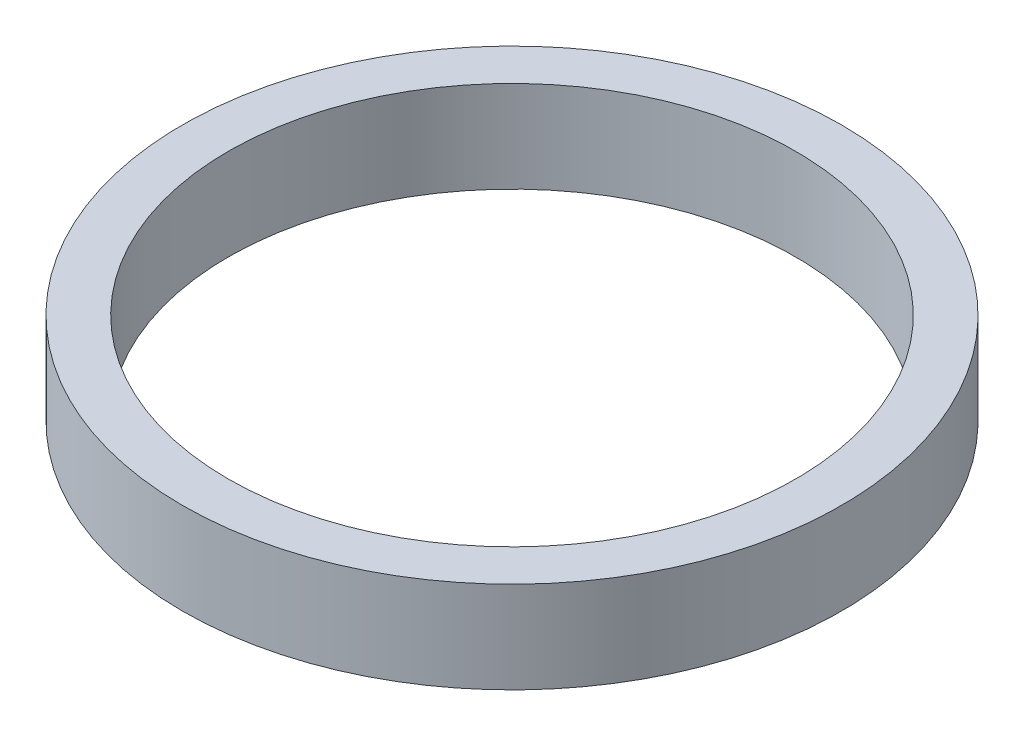
ISO-10303-21;
HEADER;
FILE_DESCRIPTION(('STEP AP214'),'2;1');
FILE_NAME('part.step','',(''),(''),'','','');
FILE_SCHEMA(('AUTOMOTIVE_DESIGN { 1 0 10303 214 1 1 1 1 }'));
ENDSEC;
DATA;
#1=APPLICATION_CONTEXT('core data for automotive mechanical design processes');
#2=APPLICATION_PROTOCOL_DEFINITION('international standard','automotive_design',2000,#1);
#3=PRODUCT_CONTEXT('',#1,'mechanical');
#4=PRODUCT('Part','Part','',(#3));
#5=PRODUCT_RELATED_PRODUCT_CATEGORY('part','',(#4));
#6=PRODUCT_DEFINITION_FORMATION('','',#4);
#7=PRODUCT_DEFINITION_CONTEXT('part definition',#1,'design');
#8=PRODUCT_DEFINITION('design','',#6,#7);
#9=PRODUCT_DEFINITION_SHAPE('','',#8);
#10=(LENGTH_UNIT() NAMED_UNIT(*) SI_UNIT(.MILLI.,.METRE.));
#11=(NAMED_UNIT(*) PLANE_ANGLE_UNIT() SI_UNIT($,.RADIAN.));
#12=(NAMED_UNIT(*) SI_UNIT($,.STERADIAN.) SOLID_ANGLE_UNIT());
#13=UNCERTAINTY_MEASURE_WITH_UNIT(LENGTH_MEASURE(1.E-05),#10,'distance_accuracy_value','');
#14=(GEOMETRIC_REPRESENTATION_CONTEXT(3) GLOBAL_UNCERTAINTY_ASSIGNED_CONTEXT((#13)) GLOBAL_UNIT_ASSIGNED_CONTEXT((#10,
#11,#12)) REPRESENTATION_CONTEXT('',''));
#15=CARTESIAN_POINT('',(0.,0.,0.));
#16=DIRECTION('',(0.,0.,1.));
#17=DIRECTION('',(1.,0.,0.));
#18=AXIS2_PLACEMENT_3D('',#15,#16,#17);
#19=CARTESIAN_POINT('',(0.,10.,0.));
#20=DIRECTION('',(0.,-1.,0.));
#21=DIRECTION('',(0.,0.,-1.));
#22=AXIS2_PLACEMENT_3D('',#19,#20,#21);
#23=CYLINDRICAL_SURFACE('',#22,36.);
#24=CARTESIAN_POINT('',(0.,10.,0.));
#25=DIRECTION('',(0.,1.,0.));
#26=DIRECTION('',(0.,0.,1.));
#27=AXIS2_PLACEMENT_3D('',#24,#25,#26);
#28=CIRCLE('',#27,36.);
#29=CARTESIAN_POINT('',(0.,10.,36.));
#30=VERTEX_POINT('',#29);
#31=EDGE_CURVE('E10',#30,#30,#28,.T.);
#32=ORIENTED_EDGE('',*,*,#31,.F.);
#33=EDGE_LOOP('',(#32));
#34=FACE_BOUND('',#33,.T.);
#35=CARTESIAN_POINT('',(0.,0.,0.));
#36=DIRECTION('',(0.,1.,0.));
#37=DIRECTION('',(0.,0.,1.));
#38=AXIS2_PLACEMENT_3D('',#35,#36,#37);
#39=CIRCLE('',#38,36.);
#40=CARTESIAN_POINT('',(0.,0.,36.));
#41=VERTEX_POINT('',#40);
#42=EDGE_CURVE('E38',#41,#41,#39,.T.);
#43=ORIENTED_EDGE('',*,*,#42,.T.);
#44=EDGE_LOOP('',(#43));
#45=FACE_BOUND('',#44,.T.);
#46=ADVANCED_FACE('F31',(#34,#45),#23,.T.);
#47=CARTESIAN_POINT('',(0.,10.,0.));
#48=DIRECTION('',(0.,1.,0.));
#49=DIRECTION('',(0.,0.,1.));
#50=AXIS2_PLACEMENT_3D('',#47,#48,#49);
#51=PLANE('',#50);
#52=CARTESIAN_POINT('',(0.,10.,0.));
#53=DIRECTION('',(0.,1.,0.));
#54=DIRECTION('',(0.,0.,1.));
#55=AXIS2_PLACEMENT_3D('',#52,#53,#54);
#56=CIRCLE('',#55,31.);
#57=CARTESIAN_POINT('',(0.,10.,31.));
#58=VERTEX_POINT('',#57);
#59=EDGE_CURVE('E44',#58,#58,#56,.T.);
#60=ORIENTED_EDGE('',*,*,#59,.F.);
#61=EDGE_LOOP('',(#60));
#62=FACE_BOUND('',#61,.T.);
#63=ORIENTED_EDGE('',*,*,#31,.T.);
#64=EDGE_LOOP('',(#63));
#65=FACE_BOUND('',#64,.T.);
#66=ADVANCED_FACE('F60',(#62,#65),#51,.T.);
#67=CARTESIAN_POINT('',(0.,0.,0.));
#68=DIRECTION('',(0.,1.,0.));
#69=DIRECTION('',(0.,0.,1.));
#70=AXIS2_PLACEMENT_3D('',#67,#68,#69);
#71=PLANE('',#70);
#72=CARTESIAN_POINT('',(0.,0.,0.));
#73=DIRECTION('',(0.,1.,0.));
#74=DIRECTION('',(0.,0.,1.));
#75=AXIS2_PLACEMENT_3D('',#72,#73,#74);
#76=CIRCLE('',#75,31.);
#77=CARTESIAN_POINT('',(0.,0.,31.));
#78=VERTEX_POINT('',#77);
#79=EDGE_CURVE('E34',#78,#78,#76,.T.);
#80=ORIENTED_EDGE('',*,*,#79,.T.);
#81=EDGE_LOOP('',(#80));
#82=FACE_BOUND('',#81,.T.);
#83=ORIENTED_EDGE('',*,*,#42,.F.);
#84=EDGE_LOOP('',(#83));
#85=FACE_BOUND('',#84,.T.);
#86=ADVANCED_FACE('F51',(#82,#85),#71,.F.);
#87=CARTESIAN_POINT('',(0.,-20.,0.));
#88=DIRECTION('',(0.,1.,0.));
#89=DIRECTION('',(0.,0.,1.));
#90=AXIS2_PLACEMENT_3D('',#87,#88,#89);
#91=CYLINDRICAL_SURFACE('',#90,31.);
#92=ORIENTED_EDGE('',*,*,#59,.T.);
#93=EDGE_LOOP('',(#92));
#94=FACE_BOUND('',#93,.T.);
#95=ORIENTED_EDGE('',*,*,#79,.F.);
#96=EDGE_LOOP('',(#95));
#97=FACE_BOUND('',#96,.T.);
#98=ADVANCED_FACE('F54',(#94,#97),#91,.F.);
#99=CLOSED_SHELL('',(#46,#66,#86,#98));
#100=MANIFOLD_SOLID_BREP('B2',#99);
#101=ADVANCED_BREP_SHAPE_REPRESENTATION('',(#18,#100),#14);
#102=SHAPE_DEFINITION_REPRESENTATION(#9,#101);
ENDSEC;
END-ISO-10303-21;
